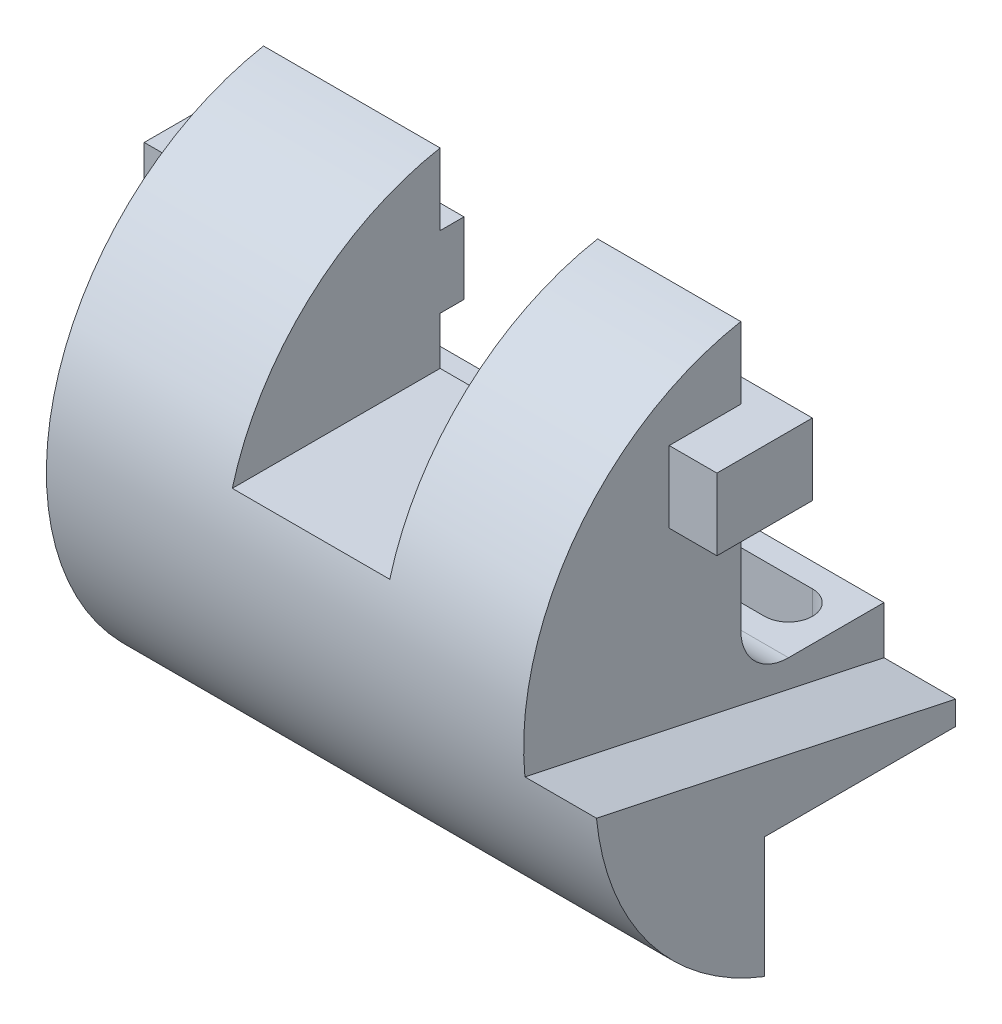
ISO-10303-21;
HEADER;
FILE_DESCRIPTION(('STEP AP214'),'2;1');
FILE_NAME('part.step','',(''),(''),'','','');
FILE_SCHEMA(('AUTOMOTIVE_DESIGN { 1 0 10303 214 1 1 1 1 }'));
ENDSEC;
DATA;
#1=APPLICATION_CONTEXT('core data for automotive mechanical design processes');
#2=APPLICATION_PROTOCOL_DEFINITION('international standard','automotive_design',2000,#1);
#3=PRODUCT_CONTEXT('',#1,'mechanical');
#4=PRODUCT('Part','Part','',(#3));
#5=PRODUCT_RELATED_PRODUCT_CATEGORY('part','',(#4));
#6=PRODUCT_DEFINITION_FORMATION('','',#4);
#7=PRODUCT_DEFINITION_CONTEXT('part definition',#1,'design');
#8=PRODUCT_DEFINITION('design','',#6,#7);
#9=PRODUCT_DEFINITION_SHAPE('','',#8);
#10=(LENGTH_UNIT() NAMED_UNIT(*) SI_UNIT(.MILLI.,.METRE.));
#11=(NAMED_UNIT(*) PLANE_ANGLE_UNIT() SI_UNIT($,.RADIAN.));
#12=(NAMED_UNIT(*) SI_UNIT($,.STERADIAN.) SOLID_ANGLE_UNIT());
#13=UNCERTAINTY_MEASURE_WITH_UNIT(LENGTH_MEASURE(1.E-05),#10,'distance_accuracy_value','');
#14=(GEOMETRIC_REPRESENTATION_CONTEXT(3) GLOBAL_UNCERTAINTY_ASSIGNED_CONTEXT((#13)) GLOBAL_UNIT_ASSIGNED_CONTEXT((#10,
#11,#12)) REPRESENTATION_CONTEXT('',''));
#15=CARTESIAN_POINT('',(0.,0.,0.));
#16=DIRECTION('',(0.,0.,1.));
#17=DIRECTION('',(1.,0.,0.));
#18=AXIS2_PLACEMENT_3D('',#15,#16,#17);
#19=CARTESIAN_POINT('',(115.,10.,30.));
#20=DIRECTION('',(0.,0.,1.));
#21=DIRECTION('',(0.,-1.,0.));
#22=AXIS2_PLACEMENT_3D('',#19,#20,#21);
#23=PLANE('',#22);
#24=DIRECTION('',(-1.,0.,0.));
#25=VECTOR('',#24,1.);
#26=CARTESIAN_POINT('',(115.,51.,30.));
#27=LINE('',#26,#25);
#28=CARTESIAN_POINT('',(100.,51.,30.));
#29=VERTEX_POINT('',#28);
#30=CARTESIAN_POINT('',(70.,51.,30.));
#31=VERTEX_POINT('',#30);
#32=EDGE_CURVE('E257',#29,#31,#27,.T.);
#33=ORIENTED_EDGE('',*,*,#32,.T.);
#34=DIRECTION('',(0.,1.,0.));
#35=VECTOR('',#34,1.);
#36=CARTESIAN_POINT('',(70.,10.,30.));
#37=LINE('',#36,#35);
#38=CARTESIAN_POINT('',(70.,66.,30.0000000000001));
#39=VERTEX_POINT('',#38);
#40=EDGE_CURVE('E752',#31,#39,#37,.T.);
#41=ORIENTED_EDGE('',*,*,#40,.T.);
#42=DIRECTION('',(-1.,0.,0.));
#43=VECTOR('',#42,1.);
#44=CARTESIAN_POINT('',(115.,66.,30.));
#45=LINE('',#44,#43);
#46=CARTESIAN_POINT('',(100.,66.,30.));
#47=VERTEX_POINT('',#46);
#48=EDGE_CURVE('E431',#47,#39,#45,.T.);
#49=ORIENTED_EDGE('',*,*,#48,.F.);
#50=DIRECTION('',(0.,1.,0.));
#51=VECTOR('',#50,1.);
#52=CARTESIAN_POINT('',(100.,0.,30.));
#53=LINE('',#52,#51);
#54=EDGE_CURVE('E278',#29,#47,#53,.T.);
#55=ORIENTED_EDGE('',*,*,#54,.F.);
#56=EDGE_LOOP('',(#33,#41,#49,#55));
#57=FACE_BOUND('',#56,.T.);
#58=ADVANCED_FACE('F37',(#57),#23,.F.);
#59=CARTESIAN_POINT('',(110.,36.,25.));
#60=DIRECTION('',(0.,-1.,0.));
#61=DIRECTION('',(0.,0.,-1.));
#62=AXIS2_PLACEMENT_3D('',#59,#60,#61);
#63=PLANE('',#62);
#64=DIRECTION('',(0.,0.,1.));
#65=VECTOR('',#64,1.);
#66=CARTESIAN_POINT('',(70.,36.,25.));
#67=LINE('',#66,#65);
#68=CARTESIAN_POINT('',(70.,36.,25.));
#69=VERTEX_POINT('',#68);
#70=CARTESIAN_POINT('',(70.,36.,30.));
#71=VERTEX_POINT('',#70);
#72=EDGE_CURVE('E331',#69,#71,#67,.T.);
#73=ORIENTED_EDGE('',*,*,#72,.F.);
#74=DIRECTION('',(-1.,0.,0.));
#75=VECTOR('',#74,1.);
#76=CARTESIAN_POINT('',(110.,36.,25.));
#77=LINE('',#76,#75);
#78=CARTESIAN_POINT('',(110.,36.,25.));
#79=VERTEX_POINT('',#78);
#80=EDGE_CURVE('E254',#79,#69,#77,.T.);
#81=ORIENTED_EDGE('',*,*,#80,.F.);
#82=DIRECTION('',(0.,0.,1.));
#83=VECTOR('',#82,1.);
#84=CARTESIAN_POINT('',(110.,36.,25.));
#85=LINE('',#84,#83);
#86=CARTESIAN_POINT('',(110.,36.,45.));
#87=VERTEX_POINT('',#86);
#88=EDGE_CURVE('E374',#79,#87,#85,.T.);
#89=ORIENTED_EDGE('',*,*,#88,.T.);
#90=DIRECTION('',(-1.,0.,0.));
#91=VECTOR('',#90,1.);
#92=CARTESIAN_POINT('',(110.,36.,45.));
#93=LINE('',#92,#91);
#94=CARTESIAN_POINT('',(100.,36.,45.));
#95=VERTEX_POINT('',#94);
#96=EDGE_CURVE('E350',#87,#95,#93,.T.);
#97=ORIENTED_EDGE('',*,*,#96,.T.);
#98=DIRECTION('',(0.,0.,-1.));
#99=VECTOR('',#98,1.);
#100=CARTESIAN_POINT('',(100.,36.,0.));
#101=LINE('',#100,#99);
#102=CARTESIAN_POINT('',(100.,36.,30.));
#103=VERTEX_POINT('',#102);
#104=EDGE_CURVE('E313',#95,#103,#101,.T.);
#105=ORIENTED_EDGE('',*,*,#104,.T.);
#106=DIRECTION('',(1.,0.,0.));
#107=VECTOR('',#106,1.);
#108=CARTESIAN_POINT('',(115.,36.,30.));
#109=LINE('',#108,#107);
#110=EDGE_CURVE('E262',#71,#103,#109,.T.);
#111=ORIENTED_EDGE('',*,*,#110,.F.);
#112=EDGE_LOOP('',(#73,#81,#89,#97,#105,#111));
#113=FACE_BOUND('',#112,.T.);
#114=ADVANCED_FACE('F339',(#113),#63,.T.);
#115=CARTESIAN_POINT('',(110.,51.,25.));
#116=DIRECTION('',(0.,1.,0.));
#117=DIRECTION('',(0.,0.,1.));
#118=AXIS2_PLACEMENT_3D('',#115,#116,#117);
#119=PLANE('',#118);
#120=DIRECTION('',(0.,0.,-1.));
#121=VECTOR('',#120,1.);
#122=CARTESIAN_POINT('',(70.,51.,25.));
#123=LINE('',#122,#121);
#124=CARTESIAN_POINT('',(70.,51.,25.));
#125=VERTEX_POINT('',#124);
#126=EDGE_CURVE('E334',#31,#125,#123,.T.);
#127=ORIENTED_EDGE('',*,*,#126,.F.);
#128=ORIENTED_EDGE('',*,*,#32,.F.);
#129=DIRECTION('',(0.,0.,1.));
#130=VECTOR('',#129,1.);
#131=CARTESIAN_POINT('',(100.,51.,0.));
#132=LINE('',#131,#130);
#133=CARTESIAN_POINT('',(100.,51.,45.));
#134=VERTEX_POINT('',#133);
#135=EDGE_CURVE('E305',#29,#134,#132,.T.);
#136=ORIENTED_EDGE('',*,*,#135,.T.);
#137=DIRECTION('',(-1.,0.,0.));
#138=VECTOR('',#137,1.);
#139=CARTESIAN_POINT('',(110.,51.,45.));
#140=LINE('',#139,#138);
#141=CARTESIAN_POINT('',(110.,51.,45.));
#142=VERTEX_POINT('',#141);
#143=EDGE_CURVE('E246',#142,#134,#140,.T.);
#144=ORIENTED_EDGE('',*,*,#143,.F.);
#145=DIRECTION('',(0.,0.,-1.));
#146=VECTOR('',#145,1.);
#147=CARTESIAN_POINT('',(110.,51.,25.));
#148=LINE('',#147,#146);
#149=CARTESIAN_POINT('',(110.,51.,25.));
#150=VERTEX_POINT('',#149);
#151=EDGE_CURVE('E367',#142,#150,#148,.T.);
#152=ORIENTED_EDGE('',*,*,#151,.T.);
#153=DIRECTION('',(-1.,0.,0.));
#154=VECTOR('',#153,1.);
#155=CARTESIAN_POINT('',(110.,51.,25.));
#156=LINE('',#155,#154);
#157=EDGE_CURVE('E245',#150,#125,#156,.T.);
#158=ORIENTED_EDGE('',*,*,#157,.T.);
#159=EDGE_LOOP('',(#127,#128,#136,#144,#152,#158));
#160=FACE_BOUND('',#159,.T.);
#161=ADVANCED_FACE('F489',(#160),#119,.T.);
#162=CARTESIAN_POINT('',(110.,51.,25.));
#163=DIRECTION('',(0.,0.,-1.));
#164=DIRECTION('',(0.,1.,0.));
#165=AXIS2_PLACEMENT_3D('',#162,#163,#164);
#166=PLANE('',#165);
#167=DIRECTION('',(0.,-1.,0.));
#168=VECTOR('',#167,1.);
#169=CARTESIAN_POINT('',(70.,51.,25.));
#170=LINE('',#169,#168);
#171=EDGE_CURVE('E45',#125,#69,#170,.T.);
#172=ORIENTED_EDGE('',*,*,#171,.F.);
#173=ORIENTED_EDGE('',*,*,#157,.F.);
#174=DIRECTION('',(0.,-1.,0.));
#175=VECTOR('',#174,1.);
#176=CARTESIAN_POINT('',(110.,51.,25.));
#177=LINE('',#176,#175);
#178=EDGE_CURVE('E347',#150,#79,#177,.T.);
#179=ORIENTED_EDGE('',*,*,#178,.T.);
#180=ORIENTED_EDGE('',*,*,#80,.T.);
#181=EDGE_LOOP('',(#172,#173,#179,#180));
#182=FACE_BOUND('',#181,.T.);
#183=ADVANCED_FACE('F345',(#182),#166,.T.);
#184=DIRECTION('',(1.,0.,0.));
#185=VECTOR('',#184,1.);
#186=CARTESIAN_POINT('',(115.,26.,30.));
#187=LINE('',#186,#185);
#188=CARTESIAN_POINT('',(37.,26.,30.));
#189=VERTEX_POINT('',#188);
#190=CARTESIAN_POINT('',(70.,26.,30.));
#191=VERTEX_POINT('',#190);
#192=EDGE_CURVE('E515',#189,#191,#187,.T.);
#193=ORIENTED_EDGE('',*,*,#192,.T.);
#194=DIRECTION('',(0.,1.,0.));
#195=VECTOR('',#194,1.);
#196=CARTESIAN_POINT('',(70.,10.,30.));
#197=LINE('',#196,#195);
#198=EDGE_CURVE('E342',#191,#71,#197,.T.);
#199=ORIENTED_EDGE('',*,*,#198,.T.);
#200=ORIENTED_EDGE('',*,*,#110,.T.);
#201=CARTESIAN_POINT('',(100.,10.,30.));
#202=VERTEX_POINT('',#201);
#203=EDGE_CURVE('E279',#202,#103,#53,.T.);
#204=ORIENTED_EDGE('',*,*,#203,.F.);
#205=DIRECTION('',(-1.,0.,0.));
#206=VECTOR('',#205,1.);
#207=CARTESIAN_POINT('',(115.,10.,30.));
#208=LINE('',#207,#206);
#209=CARTESIAN_POINT('',(0.,10.,30.));
#210=VERTEX_POINT('',#209);
#211=EDGE_CURVE('E405',#202,#210,#208,.T.);
#212=ORIENTED_EDGE('',*,*,#211,.T.);
#213=DIRECTION('',(0.,1.,0.));
#214=VECTOR('',#213,1.);
#215=CARTESIAN_POINT('',(0.,10.,30.));
#216=LINE('',#215,#214);
#217=CARTESIAN_POINT('',(0.,36.,30.));
#218=VERTEX_POINT('',#217);
#219=EDGE_CURVE('E388',#210,#218,#216,.T.);
#220=ORIENTED_EDGE('',*,*,#219,.T.);
#221=CARTESIAN_POINT('',(37.,36.,30.));
#222=VERTEX_POINT('',#221);
#223=EDGE_CURVE('E263',#218,#222,#109,.T.);
#224=ORIENTED_EDGE('',*,*,#223,.T.);
#225=DIRECTION('',(0.,-1.,0.));
#226=VECTOR('',#225,1.);
#227=CARTESIAN_POINT('',(37.,10.,30.));
#228=LINE('',#227,#226);
#229=EDGE_CURVE('E402',#222,#189,#228,.T.);
#230=ORIENTED_EDGE('',*,*,#229,.T.);
#231=EDGE_LOOP('',(#193,#199,#200,#204,#212,#220,#224,#230));
#232=FACE_BOUND('',#231,.T.);
#233=ADVANCED_FACE('F401',(#232),#23,.F.);
#234=CARTESIAN_POINT('',(115.,0.,0.));
#235=DIRECTION('',(0.,-1.,0.));
#236=DIRECTION('',(0.,0.,-1.));
#237=AXIS2_PLACEMENT_3D('',#234,#235,#236);
#238=PLANE('',#237);
#239=DIRECTION('',(1.,0.,0.));
#240=VECTOR('',#239,1.);
#241=CARTESIAN_POINT('',(10.,0.,15.));
#242=LINE('',#241,#240);
#243=CARTESIAN_POINT('',(9.99999999999999,0.,15.));
#244=VERTEX_POINT('',#243);
#245=CARTESIAN_POINT('',(90.,0.,15.));
#246=VERTEX_POINT('',#245);
#247=EDGE_CURVE('E507',#244,#246,#242,.T.);
#248=ORIENTED_EDGE('',*,*,#247,.F.);
#249=CARTESIAN_POINT('',(10.,0.,10.));
#250=DIRECTION('',(0.,1.,0.));
#251=DIRECTION('',(0.,0.,1.));
#252=AXIS2_PLACEMENT_3D('',#249,#250,#251);
#253=CIRCLE('',#252,5.);
#254=CARTESIAN_POINT('',(10.,0.,5.));
#255=VERTEX_POINT('',#254);
#256=EDGE_CURVE('E60',#255,#244,#253,.T.);
#257=ORIENTED_EDGE('',*,*,#256,.F.);
#258=DIRECTION('',(-1.,0.,0.));
#259=VECTOR('',#258,1.);
#260=CARTESIAN_POINT('',(10.,0.,5.));
#261=LINE('',#260,#259);
#262=CARTESIAN_POINT('',(90.,0.,5.));
#263=VERTEX_POINT('',#262);
#264=EDGE_CURVE('E513',#263,#255,#261,.T.);
#265=ORIENTED_EDGE('',*,*,#264,.F.);
#266=CARTESIAN_POINT('',(90.,0.,10.));
#267=DIRECTION('',(0.,1.,0.));
#268=DIRECTION('',(0.,0.,1.));
#269=AXIS2_PLACEMENT_3D('',#266,#267,#268);
#270=CIRCLE('',#269,5.);
#271=EDGE_CURVE('E510',#246,#263,#270,.T.);
#272=ORIENTED_EDGE('',*,*,#271,.F.);
#273=EDGE_LOOP('',(#248,#257,#265,#272));
#274=FACE_BOUND('',#273,.T.);
#275=DIRECTION('',(0.,0.,1.));
#276=VECTOR('',#275,1.);
#277=CARTESIAN_POINT('',(100.,0.,0.));
#278=LINE('',#277,#276);
#279=CARTESIAN_POINT('',(100.,0.,0.));
#280=VERTEX_POINT('',#279);
#281=CARTESIAN_POINT('',(100.,0.,20.));
#282=VERTEX_POINT('',#281);
#283=EDGE_CURVE('E274',#280,#282,#278,.T.);
#284=ORIENTED_EDGE('',*,*,#283,.F.);
#285=DIRECTION('',(-1.,0.,0.));
#286=VECTOR('',#285,1.);
#287=CARTESIAN_POINT('',(115.,0.,0.));
#288=LINE('',#287,#286);
#289=CARTESIAN_POINT('',(0.,0.,0.));
#290=VERTEX_POINT('',#289);
#291=EDGE_CURVE('E418',#280,#290,#288,.T.);
#292=ORIENTED_EDGE('',*,*,#291,.T.);
#293=DIRECTION('',(0.,0.,1.));
#294=VECTOR('',#293,1.);
#295=CARTESIAN_POINT('',(0.,0.,0.));
#296=LINE('',#295,#294);
#297=CARTESIAN_POINT('',(0.,0.,20.));
#298=VERTEX_POINT('',#297);
#299=EDGE_CURVE('E291',#290,#298,#296,.T.);
#300=ORIENTED_EDGE('',*,*,#299,.T.);
#301=DIRECTION('',(-1.,0.,0.));
#302=VECTOR('',#301,1.);
#303=CARTESIAN_POINT('',(115.,0.,20.));
#304=LINE('',#303,#302);
#305=EDGE_CURVE('E301',#282,#298,#304,.T.);
#306=ORIENTED_EDGE('',*,*,#305,.F.);
#307=EDGE_LOOP('',(#284,#292,#300,#306));
#308=FACE_BOUND('',#307,.T.);
#309=ADVANCED_FACE('F39',(#274,#308),#238,.F.);
#310=CARTESIAN_POINT('',(115.,10.,20.));
#311=DIRECTION('',(-1.,0.,0.));
#312=DIRECTION('',(0.,0.,1.));
#313=AXIS2_PLACEMENT_3D('',#310,#311,#312);
#314=CYLINDRICAL_SURFACE('',#313,10.);
#315=CARTESIAN_POINT('',(100.,10.,20.));
#316=DIRECTION('',(1.,0.,0.));
#317=DIRECTION('',(0.,0.,-1.));
#318=AXIS2_PLACEMENT_3D('',#315,#316,#317);
#319=CIRCLE('',#318,10.);
#320=EDGE_CURVE('E276',#282,#202,#319,.F.);
#321=ORIENTED_EDGE('',*,*,#320,.F.);
#322=ORIENTED_EDGE('',*,*,#305,.T.);
#323=CARTESIAN_POINT('',(0.,10.,20.));
#324=DIRECTION('',(-1.,0.,0.));
#325=DIRECTION('',(0.,0.,-1.));
#326=AXIS2_PLACEMENT_3D('',#323,#324,#325);
#327=CIRCLE('',#326,10.);
#328=EDGE_CURVE('E389',#298,#210,#327,.T.);
#329=ORIENTED_EDGE('',*,*,#328,.T.);
#330=ORIENTED_EDGE('',*,*,#211,.F.);
#331=EDGE_LOOP('',(#321,#322,#329,#330));
#332=FACE_BOUND('',#331,.T.);
#333=ADVANCED_FACE('F436',(#332),#314,.F.);
#334=CARTESIAN_POINT('',(37.,66.,30.0000000000001));
#335=VERTEX_POINT('',#334);
#336=CARTESIAN_POINT('',(0.,66.,30.));
#337=VERTEX_POINT('',#336);
#338=EDGE_CURVE('E430',#335,#337,#45,.T.);
#339=ORIENTED_EDGE('',*,*,#338,.F.);
#340=DIRECTION('',(0.,-1.,0.));
#341=VECTOR('',#340,1.);
#342=CARTESIAN_POINT('',(37.,10.,30.));
#343=LINE('',#342,#341);
#344=CARTESIAN_POINT('',(37.,51.,30.));
#345=VERTEX_POINT('',#344);
#346=EDGE_CURVE('E238',#335,#345,#343,.T.);
#347=ORIENTED_EDGE('',*,*,#346,.T.);
#348=CARTESIAN_POINT('',(0.,51.,30.));
#349=VERTEX_POINT('',#348);
#350=EDGE_CURVE('E237',#345,#349,#27,.T.);
#351=ORIENTED_EDGE('',*,*,#350,.T.);
#352=EDGE_CURVE('E381',#349,#337,#216,.T.);
#353=ORIENTED_EDGE('',*,*,#352,.T.);
#354=EDGE_LOOP('',(#339,#347,#351,#353));
#355=FACE_BOUND('',#354,.T.);
#356=ADVANCED_FACE('F380',(#355),#23,.F.);
#357=CARTESIAN_POINT('',(115.,11.4083339693685,20.));
#358=DIRECTION('',(-1.,0.,0.));
#359=DIRECTION('',(0.,0.,1.));
#360=AXIS2_PLACEMENT_3D('',#357,#358,#359);
#361=CYLINDRICAL_SURFACE('',#360,55.5);
#362=ORIENTED_EDGE('',*,*,#48,.T.);
#363=CARTESIAN_POINT('',(70.,11.4083339693685,20.));
#364=DIRECTION('',(1.,0.,0.));
#365=DIRECTION('',(0.,0.,-1.));
#366=AXIS2_PLACEMENT_3D('',#363,#364,#365);
#367=CIRCLE('',#366,55.5);
#368=CARTESIAN_POINT('',(70.,26.,73.5474862383895));
#369=VERTEX_POINT('',#368);
#370=EDGE_CURVE('E343',#39,#369,#367,.T.);
#371=ORIENTED_EDGE('',*,*,#370,.T.);
#372=DIRECTION('',(-1.,0.,0.));
#373=VECTOR('',#372,1.);
#374=CARTESIAN_POINT('',(115.,26.,73.5474862383895));
#375=LINE('',#374,#373);
#376=CARTESIAN_POINT('',(37.,26.,73.5474862383895));
#377=VERTEX_POINT('',#376);
#378=EDGE_CURVE('E11',#369,#377,#375,.T.);
#379=ORIENTED_EDGE('',*,*,#378,.T.);
#380=CARTESIAN_POINT('',(37.,11.4083339693685,20.));
#381=DIRECTION('',(-1.,0.,0.));
#382=DIRECTION('',(0.,-1.,0.));
#383=AXIS2_PLACEMENT_3D('',#380,#381,#382);
#384=CIRCLE('',#383,55.5);
#385=EDGE_CURVE('E766',#377,#335,#384,.T.);
#386=ORIENTED_EDGE('',*,*,#385,.T.);
#387=ORIENTED_EDGE('',*,*,#338,.T.);
#388=CARTESIAN_POINT('',(0.,11.4083339693685,20.));
#389=DIRECTION('',(1.,0.,0.));
#390=DIRECTION('',(0.,0.,1.));
#391=AXIS2_PLACEMENT_3D('',#388,#389,#390);
#392=CIRCLE('',#391,55.5);
#393=CARTESIAN_POINT('',(0.,-40.362796982157,40.));
#394=VERTEX_POINT('',#393);
#395=EDGE_CURVE('E387',#337,#394,#392,.T.);
#396=ORIENTED_EDGE('',*,*,#395,.T.);
#397=DIRECTION('',(-1.,0.,0.));
#398=VECTOR('',#397,1.);
#399=CARTESIAN_POINT('',(115.,-40.362796982157,40.));
#400=LINE('',#399,#398);
#401=CARTESIAN_POINT('',(115.,-40.362796982157,40.));
#402=VERTEX_POINT('',#401);
#403=EDGE_CURVE('E427',#402,#394,#400,.T.);
#404=ORIENTED_EDGE('',*,*,#403,.F.);
#405=CARTESIAN_POINT('',(115.,11.4083339693685,20.));
#406=DIRECTION('',(1.,0.,0.));
#407=DIRECTION('',(0.,0.,1.));
#408=AXIS2_PLACEMENT_3D('',#405,#406,#407);
#409=CIRCLE('',#408,55.5);
#410=CARTESIAN_POINT('',(115.,5.99170229989357,75.2350441418964));
#411=VERTEX_POINT('',#410);
#412=EDGE_CURVE('E297',#411,#402,#409,.T.);
#413=ORIENTED_EDGE('',*,*,#412,.F.);
#414=DIRECTION('',(1.,0.,0.));
#415=VECTOR('',#414,1.);
#416=CARTESIAN_POINT('',(100.,5.99170229989356,75.2350441418964));
#417=LINE('',#416,#415);
#418=CARTESIAN_POINT('',(100.,5.99170229989356,75.2350441418964));
#419=VERTEX_POINT('',#418);
#420=EDGE_CURVE('E285',#419,#411,#417,.T.);
#421=ORIENTED_EDGE('',*,*,#420,.F.);
#422=CARTESIAN_POINT('',(100.,11.4083339693685,20.));
#423=DIRECTION('',(1.,0.,0.));
#424=DIRECTION('',(0.,0.,-1.));
#425=AXIS2_PLACEMENT_3D('',#422,#423,#424);
#426=CIRCLE('',#425,55.5);
#427=EDGE_CURVE('E282',#47,#419,#426,.T.);
#428=ORIENTED_EDGE('',*,*,#427,.F.);
#429=EDGE_LOOP('',(#362,#371,#379,#386,#387,#396,#404,#413,#421,#428));
#430=FACE_BOUND('',#429,.T.);
#431=ADVANCED_FACE('F468',(#430),#361,.T.);
#432=CARTESIAN_POINT('',(115.,-15.,40.));
#433=DIRECTION('',(0.,0.,1.));
#434=DIRECTION('',(0.,-1.,0.));
#435=AXIS2_PLACEMENT_3D('',#432,#433,#434);
#436=PLANE('',#435);
#437=DIRECTION('',(0.,1.,0.));
#438=VECTOR('',#437,1.);
#439=CARTESIAN_POINT('',(0.,-15.,40.));
#440=LINE('',#439,#438);
#441=CARTESIAN_POINT('',(0.,-15.,40.));
#442=VERTEX_POINT('',#441);
#443=EDGE_CURVE('E408',#394,#442,#440,.T.);
#444=ORIENTED_EDGE('',*,*,#443,.T.);
#445=DIRECTION('',(-1.,0.,0.));
#446=VECTOR('',#445,1.);
#447=CARTESIAN_POINT('',(115.,-15.,40.));
#448=LINE('',#447,#446);
#449=CARTESIAN_POINT('',(115.,-15.,40.));
#450=VERTEX_POINT('',#449);
#451=EDGE_CURVE('E424',#450,#442,#448,.T.);
#452=ORIENTED_EDGE('',*,*,#451,.F.);
#453=DIRECTION('',(0.,1.,0.));
#454=VECTOR('',#453,1.);
#455=CARTESIAN_POINT('',(115.,-15.,40.));
#456=LINE('',#455,#454);
#457=EDGE_CURVE('E294',#402,#450,#456,.T.);
#458=ORIENTED_EDGE('',*,*,#457,.F.);
#459=ORIENTED_EDGE('',*,*,#403,.T.);
#460=EDGE_LOOP('',(#444,#452,#458,#459));
#461=FACE_BOUND('',#460,.T.);
#462=ADVANCED_FACE('F456',(#461),#436,.F.);
#463=CARTESIAN_POINT('',(115.,-15.,0.));
#464=DIRECTION('',(0.,1.,0.));
#465=DIRECTION('',(0.,0.,1.));
#466=AXIS2_PLACEMENT_3D('',#463,#464,#465);
#467=PLANE('',#466);
#468=DIRECTION('',(-1.,0.,0.));
#469=VECTOR('',#468,1.);
#470=CARTESIAN_POINT('',(115.,-15.,5.));
#471=LINE('',#470,#469);
#472=CARTESIAN_POINT('',(90.,-15.,5.));
#473=VERTEX_POINT('',#472);
#474=CARTESIAN_POINT('',(10.,-15.,5.));
#475=VERTEX_POINT('',#474);
#476=EDGE_CURVE('E322',#473,#475,#471,.T.);
#477=ORIENTED_EDGE('',*,*,#476,.T.);
#478=CARTESIAN_POINT('',(10.,-15.,10.));
#479=DIRECTION('',(0.,1.,0.));
#480=DIRECTION('',(0.,0.,1.));
#481=AXIS2_PLACEMENT_3D('',#478,#479,#480);
#482=CIRCLE('',#481,5.);
#483=CARTESIAN_POINT('',(10.,-15.,15.));
#484=VERTEX_POINT('',#483);
#485=EDGE_CURVE('E228',#475,#484,#482,.T.);
#486=ORIENTED_EDGE('',*,*,#485,.T.);
#487=DIRECTION('',(1.,0.,0.));
#488=VECTOR('',#487,1.);
#489=CARTESIAN_POINT('',(115.,-15.,15.));
#490=LINE('',#489,#488);
#491=CARTESIAN_POINT('',(90.,-15.,15.));
#492=VERTEX_POINT('',#491);
#493=EDGE_CURVE('E316',#484,#492,#490,.T.);
#494=ORIENTED_EDGE('',*,*,#493,.T.);
#495=CARTESIAN_POINT('',(90.,-15.,10.));
#496=DIRECTION('',(0.,1.,0.));
#497=DIRECTION('',(0.,0.,1.));
#498=AXIS2_PLACEMENT_3D('',#495,#496,#497);
#499=CIRCLE('',#498,5.);
#500=EDGE_CURVE('E319',#492,#473,#499,.T.);
#501=ORIENTED_EDGE('',*,*,#500,.T.);
#502=EDGE_LOOP('',(#477,#486,#494,#501));
#503=FACE_BOUND('',#502,.T.);
#504=DIRECTION('',(0.,0.,-1.));
#505=VECTOR('',#504,1.);
#506=CARTESIAN_POINT('',(0.,-15.,0.));
#507=LINE('',#506,#505);
#508=CARTESIAN_POINT('',(0.,-15.,0.));
#509=VERTEX_POINT('',#508);
#510=EDGE_CURVE('E414',#442,#509,#507,.T.);
#511=ORIENTED_EDGE('',*,*,#510,.T.);
#512=DIRECTION('',(-1.,0.,0.));
#513=VECTOR('',#512,1.);
#514=CARTESIAN_POINT('',(115.,-15.,0.));
#515=LINE('',#514,#513);
#516=CARTESIAN_POINT('',(115.,-15.,0.));
#517=VERTEX_POINT('',#516);
#518=EDGE_CURVE('E420',#517,#509,#515,.T.);
#519=ORIENTED_EDGE('',*,*,#518,.F.);
#520=DIRECTION('',(0.,0.,-1.));
#521=VECTOR('',#520,1.);
#522=CARTESIAN_POINT('',(115.,-15.,0.));
#523=LINE('',#522,#521);
#524=EDGE_CURVE('E445',#450,#517,#523,.T.);
#525=ORIENTED_EDGE('',*,*,#524,.F.);
#526=ORIENTED_EDGE('',*,*,#451,.T.);
#527=EDGE_LOOP('',(#511,#519,#525,#526));
#528=FACE_BOUND('',#527,.T.);
#529=ADVANCED_FACE('F459',(#503,#528),#467,.F.);
#530=CARTESIAN_POINT('',(115.,0.,0.));
#531=DIRECTION('',(0.,0.,1.));
#532=DIRECTION('',(0.,-1.,0.));
#533=AXIS2_PLACEMENT_3D('',#530,#531,#532);
#534=PLANE('',#533);
#535=DIRECTION('',(0.,1.,0.));
#536=VECTOR('',#535,1.);
#537=CARTESIAN_POINT('',(100.,0.,0.));
#538=LINE('',#537,#536);
#539=CARTESIAN_POINT('',(100.,-10.,0.));
#540=VERTEX_POINT('',#539);
#541=EDGE_CURVE('E272',#540,#280,#538,.T.);
#542=ORIENTED_EDGE('',*,*,#541,.F.);
#543=DIRECTION('',(-1.,0.,0.));
#544=VECTOR('',#543,1.);
#545=CARTESIAN_POINT('',(115.000012,-10.,0.));
#546=LINE('',#545,#544);
#547=CARTESIAN_POINT('',(115.,-10.,0.));
#548=VERTEX_POINT('',#547);
#549=EDGE_CURVE('E287',#548,#540,#546,.T.);
#550=ORIENTED_EDGE('',*,*,#549,.F.);
#551=DIRECTION('',(0.,1.,0.));
#552=VECTOR('',#551,1.);
#553=CARTESIAN_POINT('',(115.,0.,0.));
#554=LINE('',#553,#552);
#555=EDGE_CURVE('E421',#517,#548,#554,.T.);
#556=ORIENTED_EDGE('',*,*,#555,.F.);
#557=ORIENTED_EDGE('',*,*,#518,.T.);
#558=DIRECTION('',(0.,1.,0.));
#559=VECTOR('',#558,1.);
#560=CARTESIAN_POINT('',(0.,0.,0.));
#561=LINE('',#560,#559);
#562=EDGE_CURVE('E300',#509,#290,#561,.T.);
#563=ORIENTED_EDGE('',*,*,#562,.T.);
#564=ORIENTED_EDGE('',*,*,#291,.F.);
#565=EDGE_LOOP('',(#542,#550,#556,#557,#563,#564));
#566=FACE_BOUND('',#565,.T.);
#567=ADVANCED_FACE('F464',(#566),#534,.F.);
#568=CARTESIAN_POINT('',(115.,10.,20.));
#569=DIRECTION('',(1.,0.,0.));
#570=DIRECTION('',(0.,0.,-1.));
#571=AXIS2_PLACEMENT_3D('',#568,#569,#570);
#572=PLANE('',#571);
#573=DIRECTION('',(0.,-0.207911690817756,-0.978147600733806));
#574=VECTOR('',#573,1.);
#575=CARTESIAN_POINT('',(115.,-5.0680881456681,23.202821007184));
#576=LINE('',#575,#574);
#577=EDGE_CURVE('E303',#411,#548,#576,.T.);
#578=ORIENTED_EDGE('',*,*,#577,.F.);
#579=ORIENTED_EDGE('',*,*,#412,.T.);
#580=ORIENTED_EDGE('',*,*,#457,.T.);
#581=ORIENTED_EDGE('',*,*,#524,.T.);
#582=ORIENTED_EDGE('',*,*,#555,.T.);
#583=EDGE_LOOP('',(#578,#579,#580,#581,#582));
#584=FACE_BOUND('',#583,.T.);
#585=ADVANCED_FACE('F452',(#584),#572,.T.);
#586=CARTESIAN_POINT('',(0.,10.,20.));
#587=DIRECTION('',(1.,0.,0.));
#588=DIRECTION('',(0.,0.,-1.));
#589=AXIS2_PLACEMENT_3D('',#586,#587,#588);
#590=PLANE('',#589);
#591=DIRECTION('',(0.,-1.,0.));
#592=VECTOR('',#591,1.);
#593=CARTESIAN_POINT('',(0.,10.,45.));
#594=LINE('',#593,#592);
#595=CARTESIAN_POINT('',(0.,51.,45.));
#596=VERTEX_POINT('',#595);
#597=CARTESIAN_POINT('',(0.,36.,45.));
#598=VERTEX_POINT('',#597);
#599=EDGE_CURVE('E268',#596,#598,#594,.T.);
#600=ORIENTED_EDGE('',*,*,#599,.T.);
#601=DIRECTION('',(0.,0.,-1.));
#602=VECTOR('',#601,1.);
#603=CARTESIAN_POINT('',(0.,36.,20.));
#604=LINE('',#603,#602);
#605=EDGE_CURVE('E266',#598,#218,#604,.T.);
#606=ORIENTED_EDGE('',*,*,#605,.T.);
#607=ORIENTED_EDGE('',*,*,#219,.F.);
#608=ORIENTED_EDGE('',*,*,#328,.F.);
#609=ORIENTED_EDGE('',*,*,#299,.F.);
#610=ORIENTED_EDGE('',*,*,#562,.F.);
#611=ORIENTED_EDGE('',*,*,#510,.F.);
#612=ORIENTED_EDGE('',*,*,#443,.F.);
#613=ORIENTED_EDGE('',*,*,#395,.F.);
#614=ORIENTED_EDGE('',*,*,#352,.F.);
#615=DIRECTION('',(0.,0.,1.));
#616=VECTOR('',#615,1.);
#617=CARTESIAN_POINT('',(0.,51.,20.));
#618=LINE('',#617,#616);
#619=EDGE_CURVE('E260',#349,#596,#618,.T.);
#620=ORIENTED_EDGE('',*,*,#619,.T.);
#621=EDGE_LOOP('',(#600,#606,#607,#608,#609,#610,#611,#612,#613,#614,#620));
#622=FACE_BOUND('',#621,.T.);
#623=ADVANCED_FACE('F384',(#622),#590,.F.);
#624=CARTESIAN_POINT('',(115.000012,-9.56772728821302,2.03368321537897));
#625=DIRECTION('',(0.,-0.978147600733806,0.207911690817756));
#626=DIRECTION('',(0.,-0.207911690817756,-0.978147600733806));
#627=AXIS2_PLACEMENT_3D('',#624,#625,#626);
#628=PLANE('',#627);
#629=ORIENTED_EDGE('',*,*,#577,.T.);
#630=ORIENTED_EDGE('',*,*,#549,.T.);
#631=DIRECTION('',(0.,0.207911690817756,0.978147600733806));
#632=VECTOR('',#631,1.);
#633=CARTESIAN_POINT('',(100.,-9.56772728821302,2.03368321537897));
#634=LINE('',#633,#632);
#635=EDGE_CURVE('E270',#540,#419,#634,.T.);
#636=ORIENTED_EDGE('',*,*,#635,.T.);
#637=ORIENTED_EDGE('',*,*,#420,.T.);
#638=EDGE_LOOP('',(#629,#630,#636,#637));
#639=FACE_BOUND('',#638,.T.);
#640=ADVANCED_FACE('F473',(#639),#628,.F.);
#641=CARTESIAN_POINT('',(100.,0.,0.));
#642=DIRECTION('',(1.,0.,0.));
#643=DIRECTION('',(0.,0.,-1.));
#644=AXIS2_PLACEMENT_3D('',#641,#642,#643);
#645=PLANE('',#644);
#646=ORIENTED_EDGE('',*,*,#104,.F.);
#647=DIRECTION('',(0.,-1.,0.));
#648=VECTOR('',#647,1.);
#649=CARTESIAN_POINT('',(100.,0.,45.));
#650=LINE('',#649,#648);
#651=EDGE_CURVE('E310',#134,#95,#650,.T.);
#652=ORIENTED_EDGE('',*,*,#651,.F.);
#653=ORIENTED_EDGE('',*,*,#135,.F.);
#654=ORIENTED_EDGE('',*,*,#54,.T.);
#655=ORIENTED_EDGE('',*,*,#427,.T.);
#656=ORIENTED_EDGE('',*,*,#635,.F.);
#657=ORIENTED_EDGE('',*,*,#541,.T.);
#658=ORIENTED_EDGE('',*,*,#283,.T.);
#659=ORIENTED_EDGE('',*,*,#320,.T.);
#660=ORIENTED_EDGE('',*,*,#203,.T.);
#661=EDGE_LOOP('',(#646,#652,#653,#654,#655,#656,#657,#658,#659,#660));
#662=FACE_BOUND('',#661,.T.);
#663=ADVANCED_FACE('F472',(#662),#645,.T.);
#664=CARTESIAN_POINT('',(110.,51.,45.));
#665=DIRECTION('',(0.,0.,1.));
#666=DIRECTION('',(0.,-1.,0.));
#667=AXIS2_PLACEMENT_3D('',#664,#665,#666);
#668=PLANE('',#667);
#669=ORIENTED_EDGE('',*,*,#599,.F.);
#670=CARTESIAN_POINT('',(-10.,51.,45.));
#671=VERTEX_POINT('',#670);
#672=EDGE_CURVE('E251',#596,#671,#140,.T.);
#673=ORIENTED_EDGE('',*,*,#672,.T.);
#674=DIRECTION('',(0.,1.,0.));
#675=VECTOR('',#674,1.);
#676=CARTESIAN_POINT('',(-10.,51.,45.));
#677=LINE('',#676,#675);
#678=CARTESIAN_POINT('',(-10.,36.,45.));
#679=VERTEX_POINT('',#678);
#680=EDGE_CURVE('E394',#679,#671,#677,.T.);
#681=ORIENTED_EDGE('',*,*,#680,.F.);
#682=EDGE_CURVE('E349',#598,#679,#93,.T.);
#683=ORIENTED_EDGE('',*,*,#682,.F.);
#684=EDGE_LOOP('',(#669,#673,#681,#683));
#685=FACE_BOUND('',#684,.T.);
#686=ADVANCED_FACE('F393',(#685),#668,.T.);
#687=DIRECTION('',(0.,0.,-1.));
#688=VECTOR('',#687,1.);
#689=CARTESIAN_POINT('',(37.,36.,25.));
#690=LINE('',#689,#688);
#691=CARTESIAN_POINT('',(37.,36.,25.));
#692=VERTEX_POINT('',#691);
#693=EDGE_CURVE('E52',#222,#692,#690,.T.);
#694=ORIENTED_EDGE('',*,*,#693,.F.);
#695=ORIENTED_EDGE('',*,*,#223,.F.);
#696=ORIENTED_EDGE('',*,*,#605,.F.);
#697=ORIENTED_EDGE('',*,*,#682,.T.);
#698=DIRECTION('',(0.,0.,1.));
#699=VECTOR('',#698,1.);
#700=CARTESIAN_POINT('',(-10.,36.,25.));
#701=LINE('',#700,#699);
#702=CARTESIAN_POINT('',(-10.,36.,25.));
#703=VERTEX_POINT('',#702);
#704=EDGE_CURVE('E357',#703,#679,#701,.T.);
#705=ORIENTED_EDGE('',*,*,#704,.F.);
#706=EDGE_CURVE('E249',#692,#703,#77,.T.);
#707=ORIENTED_EDGE('',*,*,#706,.F.);
#708=EDGE_LOOP('',(#694,#695,#696,#697,#705,#707));
#709=FACE_BOUND('',#708,.T.);
#710=ADVANCED_FACE('F361',(#709),#63,.T.);
#711=DIRECTION('',(0.,0.,1.));
#712=VECTOR('',#711,1.);
#713=CARTESIAN_POINT('',(37.,51.,25.));
#714=LINE('',#713,#712);
#715=CARTESIAN_POINT('',(37.,51.,25.));
#716=VERTEX_POINT('',#715);
#717=EDGE_CURVE('E223',#716,#345,#714,.T.);
#718=ORIENTED_EDGE('',*,*,#717,.F.);
#719=CARTESIAN_POINT('',(-10.,51.,25.));
#720=VERTEX_POINT('',#719);
#721=EDGE_CURVE('E234',#716,#720,#156,.T.);
#722=ORIENTED_EDGE('',*,*,#721,.T.);
#723=DIRECTION('',(0.,0.,-1.));
#724=VECTOR('',#723,1.);
#725=CARTESIAN_POINT('',(-10.,51.,25.));
#726=LINE('',#725,#724);
#727=EDGE_CURVE('E359',#671,#720,#726,.T.);
#728=ORIENTED_EDGE('',*,*,#727,.F.);
#729=ORIENTED_EDGE('',*,*,#672,.F.);
#730=ORIENTED_EDGE('',*,*,#619,.F.);
#731=ORIENTED_EDGE('',*,*,#350,.F.);
#732=EDGE_LOOP('',(#718,#722,#728,#729,#730,#731));
#733=FACE_BOUND('',#732,.T.);
#734=ADVANCED_FACE('F232',(#733),#119,.T.);
#735=ORIENTED_EDGE('',*,*,#143,.T.);
#736=ORIENTED_EDGE('',*,*,#651,.T.);
#737=ORIENTED_EDGE('',*,*,#96,.F.);
#738=DIRECTION('',(0.,1.,0.));
#739=VECTOR('',#738,1.);
#740=CARTESIAN_POINT('',(110.,51.,45.));
#741=LINE('',#740,#739);
#742=EDGE_CURVE('E364',#87,#142,#741,.T.);
#743=ORIENTED_EDGE('',*,*,#742,.T.);
#744=EDGE_LOOP('',(#735,#736,#737,#743));
#745=FACE_BOUND('',#744,.T.);
#746=ADVANCED_FACE('F561',(#745),#668,.T.);
#747=DIRECTION('',(0.,1.,0.));
#748=VECTOR('',#747,1.);
#749=CARTESIAN_POINT('',(37.,51.,25.));
#750=LINE('',#749,#748);
#751=EDGE_CURVE('E220',#692,#716,#750,.T.);
#752=ORIENTED_EDGE('',*,*,#751,.F.);
#753=ORIENTED_EDGE('',*,*,#706,.T.);
#754=DIRECTION('',(0.,-1.,0.));
#755=VECTOR('',#754,1.);
#756=CARTESIAN_POINT('',(-10.,51.,25.));
#757=LINE('',#756,#755);
#758=EDGE_CURVE('E244',#720,#703,#757,.T.);
#759=ORIENTED_EDGE('',*,*,#758,.F.);
#760=ORIENTED_EDGE('',*,*,#721,.F.);
#761=EDGE_LOOP('',(#752,#753,#759,#760));
#762=FACE_BOUND('',#761,.T.);
#763=ADVANCED_FACE('F242',(#762),#166,.T.);
#764=CARTESIAN_POINT('',(110.,0.,0.));
#765=DIRECTION('',(-1.,0.,0.));
#766=DIRECTION('',(0.,0.,1.));
#767=AXIS2_PLACEMENT_3D('',#764,#765,#766);
#768=PLANE('',#767);
#769=ORIENTED_EDGE('',*,*,#742,.F.);
#770=ORIENTED_EDGE('',*,*,#88,.F.);
#771=ORIENTED_EDGE('',*,*,#178,.F.);
#772=ORIENTED_EDGE('',*,*,#151,.F.);
#773=EDGE_LOOP('',(#769,#770,#771,#772));
#774=FACE_BOUND('',#773,.T.);
#775=ADVANCED_FACE('F554',(#774),#768,.F.);
#776=CARTESIAN_POINT('',(-10.,0.,0.));
#777=DIRECTION('',(-1.,0.,0.));
#778=DIRECTION('',(0.,0.,1.));
#779=AXIS2_PLACEMENT_3D('',#776,#777,#778);
#780=PLANE('',#779);
#781=ORIENTED_EDGE('',*,*,#680,.T.);
#782=ORIENTED_EDGE('',*,*,#727,.T.);
#783=ORIENTED_EDGE('',*,*,#758,.T.);
#784=ORIENTED_EDGE('',*,*,#704,.T.);
#785=EDGE_LOOP('',(#781,#782,#783,#784));
#786=FACE_BOUND('',#785,.T.);
#787=ADVANCED_FACE('F356',(#786),#780,.T.);
#788=CARTESIAN_POINT('',(10.,-40.362821982157,10.));
#789=DIRECTION('',(0.,1.,0.));
#790=DIRECTION('',(0.,0.,1.));
#791=AXIS2_PLACEMENT_3D('',#788,#789,#790);
#792=CYLINDRICAL_SURFACE('',#791,5.);
#793=DIRECTION('',(0.,1.,0.));
#794=VECTOR('',#793,1.);
#795=CARTESIAN_POINT('',(10.,-40.362821982157,5.));
#796=LINE('',#795,#794);
#797=EDGE_CURVE('E522',#475,#255,#796,.T.);
#798=ORIENTED_EDGE('',*,*,#797,.T.);
#799=ORIENTED_EDGE('',*,*,#256,.T.);
#800=DIRECTION('',(0.,1.,0.));
#801=VECTOR('',#800,1.);
#802=CARTESIAN_POINT('',(10.,-40.362821982157,15.));
#803=LINE('',#802,#801);
#804=EDGE_CURVE('E521',#484,#244,#803,.T.);
#805=ORIENTED_EDGE('',*,*,#804,.F.);
#806=ORIENTED_EDGE('',*,*,#485,.F.);
#807=EDGE_LOOP('',(#798,#799,#805,#806));
#808=FACE_BOUND('',#807,.T.);
#809=ADVANCED_FACE('F530',(#808),#792,.F.);
#810=CARTESIAN_POINT('',(10.,-40.362821982157,5.));
#811=DIRECTION('',(0.,0.,-1.));
#812=DIRECTION('',(0.,1.,0.));
#813=AXIS2_PLACEMENT_3D('',#810,#811,#812);
#814=PLANE('',#813);
#815=DIRECTION('',(0.,1.,0.));
#816=VECTOR('',#815,1.);
#817=CARTESIAN_POINT('',(90.,-40.362821982157,5.));
#818=LINE('',#817,#816);
#819=EDGE_CURVE('E524',#473,#263,#818,.T.);
#820=ORIENTED_EDGE('',*,*,#819,.T.);
#821=ORIENTED_EDGE('',*,*,#264,.T.);
#822=ORIENTED_EDGE('',*,*,#797,.F.);
#823=ORIENTED_EDGE('',*,*,#476,.F.);
#824=EDGE_LOOP('',(#820,#821,#822,#823));
#825=FACE_BOUND('',#824,.T.);
#826=ADVANCED_FACE('F536',(#825),#814,.F.);
#827=CARTESIAN_POINT('',(90.,-40.362821982157,10.));
#828=DIRECTION('',(0.,1.,0.));
#829=DIRECTION('',(0.,0.,1.));
#830=AXIS2_PLACEMENT_3D('',#827,#828,#829);
#831=CYLINDRICAL_SURFACE('',#830,5.);
#832=DIRECTION('',(0.,1.,0.));
#833=VECTOR('',#832,1.);
#834=CARTESIAN_POINT('',(90.,-40.362821982157,15.));
#835=LINE('',#834,#833);
#836=EDGE_CURVE('E526',#492,#246,#835,.T.);
#837=ORIENTED_EDGE('',*,*,#836,.T.);
#838=ORIENTED_EDGE('',*,*,#271,.T.);
#839=ORIENTED_EDGE('',*,*,#819,.F.);
#840=ORIENTED_EDGE('',*,*,#500,.F.);
#841=EDGE_LOOP('',(#837,#838,#839,#840));
#842=FACE_BOUND('',#841,.T.);
#843=ADVANCED_FACE('F538',(#842),#831,.F.);
#844=CARTESIAN_POINT('',(10.,-40.362821982157,15.));
#845=DIRECTION('',(0.,0.,1.));
#846=DIRECTION('',(0.,-1.,0.));
#847=AXIS2_PLACEMENT_3D('',#844,#845,#846);
#848=PLANE('',#847);
#849=ORIENTED_EDGE('',*,*,#804,.T.);
#850=ORIENTED_EDGE('',*,*,#247,.T.);
#851=ORIENTED_EDGE('',*,*,#836,.F.);
#852=ORIENTED_EDGE('',*,*,#493,.F.);
#853=EDGE_LOOP('',(#849,#850,#851,#852));
#854=FACE_BOUND('',#853,.T.);
#855=ADVANCED_FACE('F529',(#854),#848,.F.);
#856=CARTESIAN_POINT('',(70.,26.,75.5));
#857=DIRECTION('',(0.,-1.,0.));
#858=DIRECTION('',(0.,0.,-1.));
#859=AXIS2_PLACEMENT_3D('',#856,#857,#858);
#860=PLANE('',#859);
#861=DIRECTION('',(0.,0.,-1.));
#862=VECTOR('',#861,1.);
#863=CARTESIAN_POINT('',(37.,26.,75.5));
#864=LINE('',#863,#862);
#865=EDGE_CURVE('E239',#377,#189,#864,.T.);
#866=ORIENTED_EDGE('',*,*,#865,.F.);
#867=ORIENTED_EDGE('',*,*,#378,.F.);
#868=DIRECTION('',(0.,0.,-1.));
#869=VECTOR('',#868,1.);
#870=CARTESIAN_POINT('',(70.,26.,75.5));
#871=LINE('',#870,#869);
#872=EDGE_CURVE('E765',#369,#191,#871,.T.);
#873=ORIENTED_EDGE('',*,*,#872,.T.);
#874=ORIENTED_EDGE('',*,*,#192,.F.);
#875=EDGE_LOOP('',(#866,#867,#873,#874));
#876=FACE_BOUND('',#875,.T.);
#877=ADVANCED_FACE('F545',(#876),#860,.F.);
#878=CARTESIAN_POINT('',(70.,66.,75.5));
#879=DIRECTION('',(1.,0.,0.));
#880=DIRECTION('',(0.,0.,-1.));
#881=AXIS2_PLACEMENT_3D('',#878,#879,#880);
#882=PLANE('',#881);
#883=ORIENTED_EDGE('',*,*,#872,.F.);
#884=ORIENTED_EDGE('',*,*,#370,.F.);
#885=ORIENTED_EDGE('',*,*,#40,.F.);
#886=ORIENTED_EDGE('',*,*,#126,.T.);
#887=ORIENTED_EDGE('',*,*,#171,.T.);
#888=ORIENTED_EDGE('',*,*,#72,.T.);
#889=ORIENTED_EDGE('',*,*,#198,.F.);
#890=EDGE_LOOP('',(#883,#884,#885,#886,#887,#888,#889));
#891=FACE_BOUND('',#890,.T.);
#892=ADVANCED_FACE('F330',(#891),#882,.F.);
#893=CARTESIAN_POINT('',(37.,66.,75.5));
#894=DIRECTION('',(-1.,0.,0.));
#895=DIRECTION('',(0.,-1.,0.));
#896=AXIS2_PLACEMENT_3D('',#893,#894,#895);
#897=PLANE('',#896);
#898=ORIENTED_EDGE('',*,*,#693,.T.);
#899=ORIENTED_EDGE('',*,*,#751,.T.);
#900=ORIENTED_EDGE('',*,*,#717,.T.);
#901=ORIENTED_EDGE('',*,*,#346,.F.);
#902=ORIENTED_EDGE('',*,*,#385,.F.);
#903=ORIENTED_EDGE('',*,*,#865,.T.);
#904=ORIENTED_EDGE('',*,*,#229,.F.);
#905=EDGE_LOOP('',(#898,#899,#900,#901,#902,#903,#904));
#906=FACE_BOUND('',#905,.T.);
#907=ADVANCED_FACE('F222',(#906),#897,.F.);
#908=CLOSED_SHELL('',(#58,#114,#161,#183,#233,#309,#333,#356,#431,#462,#529,#567,#585,#623,#640,
#663,#686,#710,#734,#746,#763,#775,#787,#809,#826,#843,#855,#877,#892,#907));
#909=MANIFOLD_SOLID_BREP('B2',#908);
#910=ADVANCED_BREP_SHAPE_REPRESENTATION('',(#18,#909),#14);
#911=SHAPE_DEFINITION_REPRESENTATION(#9,#910);
ENDSEC;
END-ISO-10303-21;
